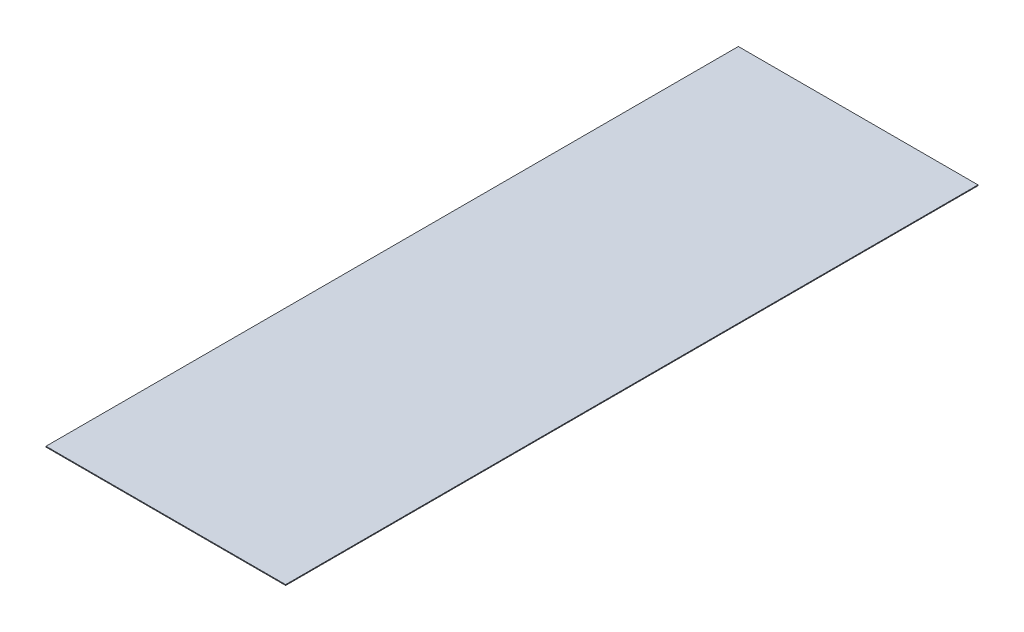
ISO-10303-21;
HEADER;
FILE_DESCRIPTION(('STEP AP214'),'2;1');
FILE_NAME('part.step','',(''),(''),'','','');
FILE_SCHEMA(('AUTOMOTIVE_DESIGN { 1 0 10303 214 1 1 1 1 }'));
ENDSEC;
DATA;
#1=APPLICATION_CONTEXT('core data for automotive mechanical design processes');
#2=APPLICATION_PROTOCOL_DEFINITION('international standard','automotive_design',2000,#1);
#3=PRODUCT_CONTEXT('',#1,'mechanical');
#4=PRODUCT('Part','Part','',(#3));
#5=PRODUCT_RELATED_PRODUCT_CATEGORY('part','',(#4));
#6=PRODUCT_DEFINITION_FORMATION('','',#4);
#7=PRODUCT_DEFINITION_CONTEXT('part definition',#1,'design');
#8=PRODUCT_DEFINITION('design','',#6,#7);
#9=PRODUCT_DEFINITION_SHAPE('','',#8);
#10=(LENGTH_UNIT() NAMED_UNIT(*) SI_UNIT(.MILLI.,.METRE.));
#11=(NAMED_UNIT(*) PLANE_ANGLE_UNIT() SI_UNIT($,.RADIAN.));
#12=(NAMED_UNIT(*) SI_UNIT($,.STERADIAN.) SOLID_ANGLE_UNIT());
#13=UNCERTAINTY_MEASURE_WITH_UNIT(LENGTH_MEASURE(1.E-05),#10,'distance_accuracy_value','');
#14=(GEOMETRIC_REPRESENTATION_CONTEXT(3) GLOBAL_UNCERTAINTY_ASSIGNED_CONTEXT((#13)) GLOBAL_UNIT_ASSIGNED_CONTEXT((#10,
#11,#12)) REPRESENTATION_CONTEXT('',''));
#15=CARTESIAN_POINT('',(0.,0.,0.));
#16=DIRECTION('',(0.,0.,1.));
#17=DIRECTION('',(1.,0.,0.));
#18=AXIS2_PLACEMENT_3D('',#15,#16,#17);
#19=CARTESIAN_POINT('',(450.,3.,1006.16979290753));
#20=DIRECTION('',(-1.,0.,0.));
#21=DIRECTION('',(0.,0.,1.));
#22=AXIS2_PLACEMENT_3D('',#19,#20,#21);
#23=PLANE('',#22);
#24=DIRECTION('',(0.,0.,-1.));
#25=VECTOR('',#24,1.);
#26=CARTESIAN_POINT('',(450.,0.,1006.16979290753));
#27=LINE('',#26,#25);
#28=CARTESIAN_POINT('',(450.,0.,1006.16979290753));
#29=VERTEX_POINT('',#28);
#30=CARTESIAN_POINT('',(450.,0.,-1593.83020709247));
#31=VERTEX_POINT('',#30);
#32=EDGE_CURVE('E98',#29,#31,#27,.T.);
#33=ORIENTED_EDGE('',*,*,#32,.T.);
#34=DIRECTION('',(0.,-1.,0.));
#35=VECTOR('',#34,1.);
#36=CARTESIAN_POINT('',(450.,3.,-1593.83020709247));
#37=LINE('',#36,#35);
#38=CARTESIAN_POINT('',(450.,3.,-1593.83020709247));
#39=VERTEX_POINT('',#38);
#40=EDGE_CURVE('E11',#39,#31,#37,.T.);
#41=ORIENTED_EDGE('',*,*,#40,.F.);
#42=DIRECTION('',(0.,0.,-1.));
#43=VECTOR('',#42,1.);
#44=CARTESIAN_POINT('',(450.,3.,1006.16979290753));
#45=LINE('',#44,#43);
#46=CARTESIAN_POINT('',(450.,3.,1006.16979290753));
#47=VERTEX_POINT('',#46);
#48=EDGE_CURVE('E86',#47,#39,#45,.T.);
#49=ORIENTED_EDGE('',*,*,#48,.F.);
#50=DIRECTION('',(0.,-1.,0.));
#51=VECTOR('',#50,1.);
#52=CARTESIAN_POINT('',(450.,3.,1006.16979290753));
#53=LINE('',#52,#51);
#54=EDGE_CURVE('E94',#47,#29,#53,.T.);
#55=ORIENTED_EDGE('',*,*,#54,.T.);
#56=EDGE_LOOP('',(#33,#41,#49,#55));
#57=FACE_BOUND('',#56,.T.);
#58=ADVANCED_FACE('F35',(#57),#23,.F.);
#59=CARTESIAN_POINT('',(450.,3.,-1593.83020709247));
#60=DIRECTION('',(0.,0.,1.));
#61=DIRECTION('',(1.,0.,0.));
#62=AXIS2_PLACEMENT_3D('',#59,#60,#61);
#63=PLANE('',#62);
#64=DIRECTION('',(-1.,0.,0.));
#65=VECTOR('',#64,1.);
#66=CARTESIAN_POINT('',(450.,0.,-1593.83020709247));
#67=LINE('',#66,#65);
#68=CARTESIAN_POINT('',(-450.,0.,-1593.83020709247));
#69=VERTEX_POINT('',#68);
#70=EDGE_CURVE('E90',#31,#69,#67,.T.);
#71=ORIENTED_EDGE('',*,*,#70,.T.);
#72=DIRECTION('',(0.,-1.,0.));
#73=VECTOR('',#72,1.);
#74=CARTESIAN_POINT('',(-450.,3.,-1593.83020709247));
#75=LINE('',#74,#73);
#76=CARTESIAN_POINT('',(-450.,3.,-1593.83020709247));
#77=VERTEX_POINT('',#76);
#78=EDGE_CURVE('E43',#77,#69,#75,.T.);
#79=ORIENTED_EDGE('',*,*,#78,.F.);
#80=DIRECTION('',(-1.,0.,0.));
#81=VECTOR('',#80,1.);
#82=CARTESIAN_POINT('',(450.,3.,-1593.83020709247));
#83=LINE('',#82,#81);
#84=EDGE_CURVE('E81',#39,#77,#83,.T.);
#85=ORIENTED_EDGE('',*,*,#84,.F.);
#86=ORIENTED_EDGE('',*,*,#40,.T.);
#87=EDGE_LOOP('',(#71,#79,#85,#86));
#88=FACE_BOUND('',#87,.T.);
#89=ADVANCED_FACE('F89',(#88),#63,.F.);
#90=CARTESIAN_POINT('',(-450.,3.,1006.16979290753));
#91=DIRECTION('',(1.,0.,0.));
#92=DIRECTION('',(0.,0.,-1.));
#93=AXIS2_PLACEMENT_3D('',#90,#91,#92);
#94=PLANE('',#93);
#95=DIRECTION('',(0.,0.,1.));
#96=VECTOR('',#95,1.);
#97=CARTESIAN_POINT('',(-450.,0.,1006.16979290753));
#98=LINE('',#97,#96);
#99=CARTESIAN_POINT('',(-450.,0.,1006.16979290753));
#100=VERTEX_POINT('',#99);
#101=EDGE_CURVE('E68',#69,#100,#98,.T.);
#102=ORIENTED_EDGE('',*,*,#101,.T.);
#103=DIRECTION('',(0.,-1.,0.));
#104=VECTOR('',#103,1.);
#105=CARTESIAN_POINT('',(-450.,3.,1006.16979290753));
#106=LINE('',#105,#104);
#107=CARTESIAN_POINT('',(-450.,3.,1006.16979290753));
#108=VERTEX_POINT('',#107);
#109=EDGE_CURVE('E91',#108,#100,#106,.T.);
#110=ORIENTED_EDGE('',*,*,#109,.F.);
#111=DIRECTION('',(0.,0.,1.));
#112=VECTOR('',#111,1.);
#113=CARTESIAN_POINT('',(-450.,3.,1006.16979290753));
#114=LINE('',#113,#112);
#115=EDGE_CURVE('E84',#77,#108,#114,.T.);
#116=ORIENTED_EDGE('',*,*,#115,.F.);
#117=ORIENTED_EDGE('',*,*,#78,.T.);
#118=EDGE_LOOP('',(#102,#110,#116,#117));
#119=FACE_BOUND('',#118,.T.);
#120=ADVANCED_FACE('F92',(#119),#94,.F.);
#121=CARTESIAN_POINT('',(450.,3.,1006.16979290753));
#122=DIRECTION('',(0.,0.,-1.));
#123=DIRECTION('',(-1.,0.,0.));
#124=AXIS2_PLACEMENT_3D('',#121,#122,#123);
#125=PLANE('',#124);
#126=DIRECTION('',(1.,0.,0.));
#127=VECTOR('',#126,1.);
#128=CARTESIAN_POINT('',(450.,0.,1006.16979290753));
#129=LINE('',#128,#127);
#130=EDGE_CURVE('E74',#100,#29,#129,.T.);
#131=ORIENTED_EDGE('',*,*,#130,.T.);
#132=ORIENTED_EDGE('',*,*,#54,.F.);
#133=DIRECTION('',(1.,0.,0.));
#134=VECTOR('',#133,1.);
#135=CARTESIAN_POINT('',(450.,3.,1006.16979290753));
#136=LINE('',#135,#134);
#137=EDGE_CURVE('E51',#108,#47,#136,.T.);
#138=ORIENTED_EDGE('',*,*,#137,.F.);
#139=ORIENTED_EDGE('',*,*,#109,.T.);
#140=EDGE_LOOP('',(#131,#132,#138,#139));
#141=FACE_BOUND('',#140,.T.);
#142=ADVANCED_FACE('F105',(#141),#125,.F.);
#143=CARTESIAN_POINT('',(0.,3.,0.));
#144=DIRECTION('',(0.,1.,0.));
#145=DIRECTION('',(0.,0.,1.));
#146=AXIS2_PLACEMENT_3D('',#143,#144,#145);
#147=PLANE('',#146);
#148=ORIENTED_EDGE('',*,*,#48,.T.);
#149=ORIENTED_EDGE('',*,*,#84,.T.);
#150=ORIENTED_EDGE('',*,*,#115,.T.);
#151=ORIENTED_EDGE('',*,*,#137,.T.);
#152=EDGE_LOOP('',(#148,#149,#150,#151));
#153=FACE_BOUND('',#152,.T.);
#154=ADVANCED_FACE('F82',(#153),#147,.T.);
#155=CARTESIAN_POINT('',(0.,0.,0.));
#156=DIRECTION('',(0.,1.,0.));
#157=DIRECTION('',(0.,0.,1.));
#158=AXIS2_PLACEMENT_3D('',#155,#156,#157);
#159=PLANE('',#158);
#160=ORIENTED_EDGE('',*,*,#32,.F.);
#161=ORIENTED_EDGE('',*,*,#130,.F.);
#162=ORIENTED_EDGE('',*,*,#101,.F.);
#163=ORIENTED_EDGE('',*,*,#70,.F.);
#164=EDGE_LOOP('',(#160,#161,#162,#163));
#165=FACE_BOUND('',#164,.T.);
#166=ADVANCED_FACE('F108',(#165),#159,.F.);
#167=CLOSED_SHELL('',(#58,#89,#120,#142,#154,#166));
#168=MANIFOLD_SOLID_BREP('B2',#167);
#169=ADVANCED_BREP_SHAPE_REPRESENTATION('',(#18,#168),#14);
#170=SHAPE_DEFINITION_REPRESENTATION(#9,#169);
ENDSEC;
END-ISO-10303-21;
